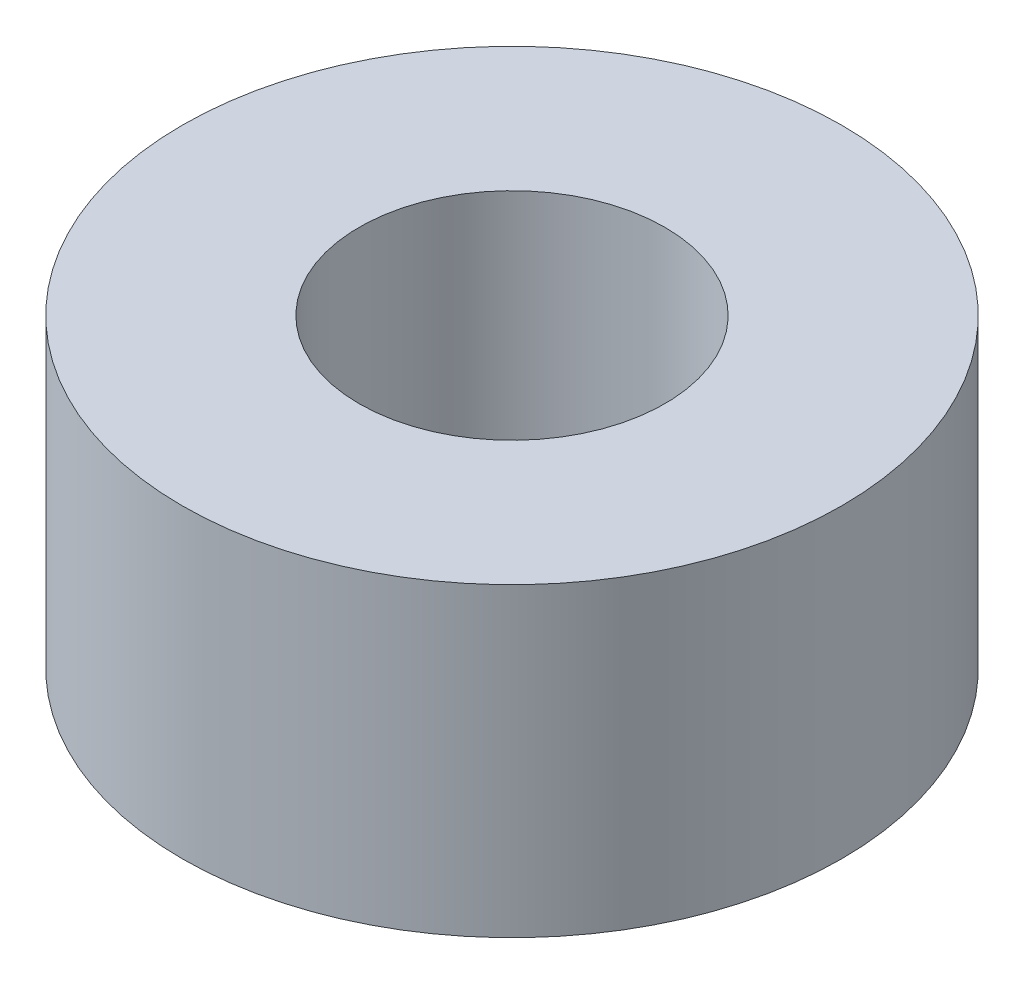
ISO-10303-21;
HEADER;
FILE_DESCRIPTION(('STEP AP214'),'2;1');
FILE_NAME('part.step','',(''),(''),'','','');
FILE_SCHEMA(('AUTOMOTIVE_DESIGN { 1 0 10303 214 1 1 1 1 }'));
ENDSEC;
DATA;
#1=APPLICATION_CONTEXT('core data for automotive mechanical design processes');
#2=APPLICATION_PROTOCOL_DEFINITION('international standard','automotive_design',2000,#1);
#3=PRODUCT_CONTEXT('',#1,'mechanical');
#4=PRODUCT('Part','Part','',(#3));
#5=PRODUCT_RELATED_PRODUCT_CATEGORY('part','',(#4));
#6=PRODUCT_DEFINITION_FORMATION('','',#4);
#7=PRODUCT_DEFINITION_CONTEXT('part definition',#1,'design');
#8=PRODUCT_DEFINITION('design','',#6,#7);
#9=PRODUCT_DEFINITION_SHAPE('','',#8);
#10=(LENGTH_UNIT() NAMED_UNIT(*) SI_UNIT(.MILLI.,.METRE.));
#11=(NAMED_UNIT(*) PLANE_ANGLE_UNIT() SI_UNIT($,.RADIAN.));
#12=(NAMED_UNIT(*) SI_UNIT($,.STERADIAN.) SOLID_ANGLE_UNIT());
#13=UNCERTAINTY_MEASURE_WITH_UNIT(LENGTH_MEASURE(1.E-05),#10,'distance_accuracy_value','');
#14=(GEOMETRIC_REPRESENTATION_CONTEXT(3) GLOBAL_UNCERTAINTY_ASSIGNED_CONTEXT((#13)) GLOBAL_UNIT_ASSIGNED_CONTEXT((#10,
#11,#12)) REPRESENTATION_CONTEXT('',''));
#15=CARTESIAN_POINT('',(0.,0.,0.));
#16=DIRECTION('',(0.,0.,1.));
#17=DIRECTION('',(1.,0.,0.));
#18=AXIS2_PLACEMENT_3D('',#15,#16,#17);
#19=CARTESIAN_POINT('',(0.,5.1,0.));
#20=DIRECTION('',(0.,1.,0.));
#21=DIRECTION('',(0.,0.,1.));
#22=AXIS2_PLACEMENT_3D('',#19,#20,#21);
#23=PLANE('',#22);
#24=CARTESIAN_POINT('',(0.,5.1,0.));
#25=DIRECTION('',(0.,1.,0.));
#26=DIRECTION('',(0.,0.,1.));
#27=AXIS2_PLACEMENT_3D('',#24,#25,#26);
#28=CIRCLE('',#27,5.5);
#29=CARTESIAN_POINT('',(0.,5.1,5.5));
#30=VERTEX_POINT('',#29);
#31=EDGE_CURVE('E10',#30,#30,#28,.T.);
#32=ORIENTED_EDGE('',*,*,#31,.T.);
#33=EDGE_LOOP('',(#32));
#34=FACE_BOUND('',#33,.T.);
#35=CARTESIAN_POINT('',(0.,5.1,0.));
#36=DIRECTION('',(0.,1.,0.));
#37=DIRECTION('',(0.,0.,1.));
#38=AXIS2_PLACEMENT_3D('',#35,#36,#37);
#39=CIRCLE('',#38,2.55);
#40=CARTESIAN_POINT('',(0.,5.1,2.55));
#41=VERTEX_POINT('',#40);
#42=EDGE_CURVE('E46',#41,#41,#39,.T.);
#43=ORIENTED_EDGE('',*,*,#42,.F.);
#44=EDGE_LOOP('',(#43));
#45=FACE_BOUND('',#44,.T.);
#46=ADVANCED_FACE('F35',(#34,#45),#23,.T.);
#47=CARTESIAN_POINT('',(0.,0.,0.));
#48=DIRECTION('',(0.,1.,0.));
#49=DIRECTION('',(0.,0.,1.));
#50=AXIS2_PLACEMENT_3D('',#47,#48,#49);
#51=PLANE('',#50);
#52=CARTESIAN_POINT('',(0.,0.,0.));
#53=DIRECTION('',(0.,1.,0.));
#54=DIRECTION('',(0.,0.,1.));
#55=AXIS2_PLACEMENT_3D('',#52,#53,#54);
#56=CIRCLE('',#55,5.5);
#57=CARTESIAN_POINT('',(0.,0.,5.5));
#58=VERTEX_POINT('',#57);
#59=EDGE_CURVE('E39',#58,#58,#56,.T.);
#60=ORIENTED_EDGE('',*,*,#59,.F.);
#61=EDGE_LOOP('',(#60));
#62=FACE_BOUND('',#61,.T.);
#63=CARTESIAN_POINT('',(0.,0.,0.));
#64=DIRECTION('',(0.,1.,0.));
#65=DIRECTION('',(0.,0.,1.));
#66=AXIS2_PLACEMENT_3D('',#63,#64,#65);
#67=CIRCLE('',#66,2.55);
#68=CARTESIAN_POINT('',(0.,0.,2.55));
#69=VERTEX_POINT('',#68);
#70=EDGE_CURVE('E48',#69,#69,#67,.T.);
#71=ORIENTED_EDGE('',*,*,#70,.T.);
#72=EDGE_LOOP('',(#71));
#73=FACE_BOUND('',#72,.T.);
#74=ADVANCED_FACE('F58',(#62,#73),#51,.F.);
#75=CARTESIAN_POINT('',(0.,5.1,0.));
#76=DIRECTION('',(0.,-1.,0.));
#77=DIRECTION('',(0.,0.,-1.));
#78=AXIS2_PLACEMENT_3D('',#75,#76,#77);
#79=CYLINDRICAL_SURFACE('',#78,5.5);
#80=ORIENTED_EDGE('',*,*,#31,.F.);
#81=EDGE_LOOP('',(#80));
#82=FACE_BOUND('',#81,.T.);
#83=ORIENTED_EDGE('',*,*,#59,.T.);
#84=EDGE_LOOP('',(#83));
#85=FACE_BOUND('',#84,.T.);
#86=ADVANCED_FACE('F37',(#82,#85),#79,.T.);
#87=CARTESIAN_POINT('',(0.,5.1,0.));
#88=DIRECTION('',(0.,-1.,0.));
#89=DIRECTION('',(0.,0.,-1.));
#90=AXIS2_PLACEMENT_3D('',#87,#88,#89);
#91=CYLINDRICAL_SURFACE('',#90,2.55);
#92=ORIENTED_EDGE('',*,*,#42,.T.);
#93=EDGE_LOOP('',(#92));
#94=FACE_BOUND('',#93,.T.);
#95=ORIENTED_EDGE('',*,*,#70,.F.);
#96=EDGE_LOOP('',(#95));
#97=FACE_BOUND('',#96,.T.);
#98=ADVANCED_FACE('F54',(#94,#97),#91,.F.);
#99=CLOSED_SHELL('',(#46,#74,#86,#98));
#100=MANIFOLD_SOLID_BREP('B2',#99);
#101=ADVANCED_BREP_SHAPE_REPRESENTATION('',(#18,#100),#14);
#102=SHAPE_DEFINITION_REPRESENTATION(#9,#101);
ENDSEC;
END-ISO-10303-21;
